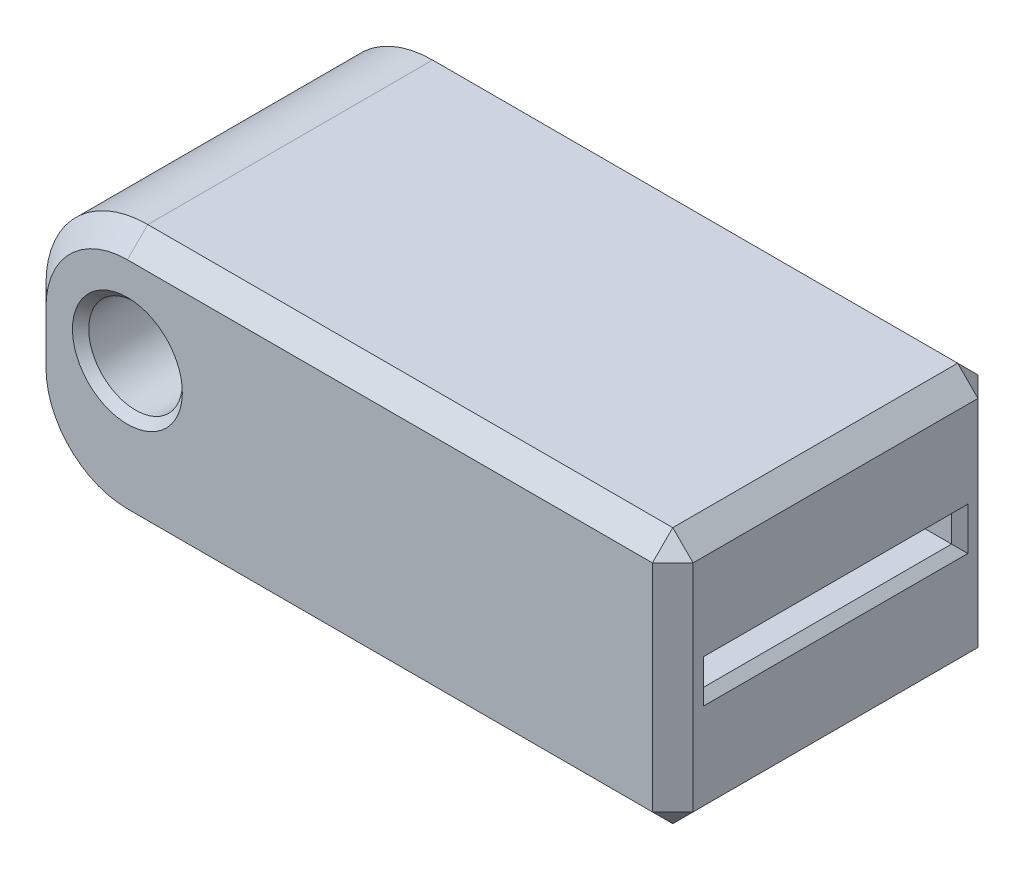
ISO-10303-21;
HEADER;
FILE_DESCRIPTION(('STEP AP214'),'2;1');
FILE_NAME('part.step','',(''),(''),'','','');
FILE_SCHEMA(('AUTOMOTIVE_DESIGN { 1 0 10303 214 1 1 1 1 }'));
ENDSEC;
DATA;
#1=APPLICATION_CONTEXT('core data for automotive mechanical design processes');
#2=APPLICATION_PROTOCOL_DEFINITION('international standard','automotive_design',2000,#1);
#3=PRODUCT_CONTEXT('',#1,'mechanical');
#4=PRODUCT('Part','Part','',(#3));
#5=PRODUCT_RELATED_PRODUCT_CATEGORY('part','',(#4));
#6=PRODUCT_DEFINITION_FORMATION('','',#4);
#7=PRODUCT_DEFINITION_CONTEXT('part definition',#1,'design');
#8=PRODUCT_DEFINITION('design','',#6,#7);
#9=PRODUCT_DEFINITION_SHAPE('','',#8);
#10=(LENGTH_UNIT() NAMED_UNIT(*) SI_UNIT(.MILLI.,.METRE.));
#11=(NAMED_UNIT(*) PLANE_ANGLE_UNIT() SI_UNIT($,.RADIAN.));
#12=(NAMED_UNIT(*) SI_UNIT($,.STERADIAN.) SOLID_ANGLE_UNIT());
#13=UNCERTAINTY_MEASURE_WITH_UNIT(LENGTH_MEASURE(1.E-05),#10,'distance_accuracy_value','');
#14=(GEOMETRIC_REPRESENTATION_CONTEXT(3) GLOBAL_UNCERTAINTY_ASSIGNED_CONTEXT((#13)) GLOBAL_UNIT_ASSIGNED_CONTEXT((#10,
#11,#12)) REPRESENTATION_CONTEXT('',''));
#15=CARTESIAN_POINT('',(0.,0.,0.));
#16=DIRECTION('',(0.,0.,1.));
#17=DIRECTION('',(1.,0.,0.));
#18=AXIS2_PLACEMENT_3D('',#15,#16,#17);
#19=CARTESIAN_POINT('',(51.272609700762,-20.251547834568,7.7312075884992));
#20=DIRECTION('',(0.,0.,-1.));
#21=DIRECTION('',(0.,1.,0.));
#22=AXIS2_PLACEMENT_3D('',#19,#20,#21);
#23=CYLINDRICAL_SURFACE('',#22,1.15);
#24=CARTESIAN_POINT('',(51.272609700762,-20.2515478345679,-10.95));
#25=DIRECTION('',(0.,0.,-1.));
#26=DIRECTION('',(0.,-1.,0.));
#27=AXIS2_PLACEMENT_3D('',#24,#25,#26);
#28=CIRCLE('',#27,1.15);
#29=CARTESIAN_POINT('',(51.272609700762,-21.4015478345679,-10.95));
#30=VERTEX_POINT('',#29);
#31=EDGE_CURVE('E19',#30,#30,#28,.T.);
#32=ORIENTED_EDGE('',*,*,#31,.T.);
#33=EDGE_LOOP('',(#32));
#34=FACE_BOUND('',#33,.T.);
#35=CARTESIAN_POINT('',(51.272609700762,-20.251547834568,-3.35));
#36=DIRECTION('',(0.,0.,1.));
#37=DIRECTION('',(0.,1.,0.));
#38=AXIS2_PLACEMENT_3D('',#35,#36,#37);
#39=CIRCLE('',#38,1.15);
#40=CARTESIAN_POINT('',(51.272609700762,-19.101547834568,-3.35));
#41=VERTEX_POINT('',#40);
#42=EDGE_CURVE('E91',#41,#41,#39,.T.);
#43=ORIENTED_EDGE('',*,*,#42,.T.);
#44=EDGE_LOOP('',(#43));
#45=FACE_BOUND('',#44,.T.);
#46=ADVANCED_FACE('F16',(#34,#45),#23,.F.);
#47=CARTESIAN_POINT('',(53.672609700762,-20.4265478345679,-7.15));
#48=DIRECTION('',(0.,-1.,0.));
#49=DIRECTION('',(0.,0.,-1.));
#50=AXIS2_PLACEMENT_3D('',#47,#48,#49);
#51=CYLINDRICAL_SURFACE('',#50,0.75);
#52=CARTESIAN_POINT('',(53.672609700762,-23.7015478345679,-7.15));
#53=DIRECTION('',(0.,-1.,0.));
#54=DIRECTION('',(0.,0.,1.));
#55=AXIS2_PLACEMENT_3D('',#52,#53,#54);
#56=CIRCLE('',#55,0.75);
#57=CARTESIAN_POINT('',(53.672609700762,-23.7015478345679,-6.4));
#58=VERTEX_POINT('',#57);
#59=EDGE_CURVE('E10',#58,#58,#56,.T.);
#60=ORIENTED_EDGE('',*,*,#59,.T.);
#61=EDGE_LOOP('',(#60));
#62=FACE_BOUND('',#61,.T.);
#63=DIRECTION('',(0.,1.,0.));
#64=VECTOR('',#63,1.);
#65=CARTESIAN_POINT('',(53.672609700762,-20.4265478345679,-7.9));
#66=LINE('',#65,#64);
#67=CARTESIAN_POINT('',(53.672609700762,-21.2765478345679,-7.9));
#68=VERTEX_POINT('',#67);
#69=CARTESIAN_POINT('',(53.672609700762,-20.6265478345679,-7.9));
#70=VERTEX_POINT('',#69);
#71=EDGE_CURVE('E94',#68,#70,#66,.T.);
#72=ORIENTED_EDGE('',*,*,#71,.T.);
#73=CARTESIAN_POINT('',(53.672609700762,-20.6265478345679,-7.15));
#74=DIRECTION('',(0.,1.,0.));
#75=DIRECTION('',(0.,0.,-1.));
#76=AXIS2_PLACEMENT_3D('',#73,#74,#75);
#77=CIRCLE('',#76,0.75);
#78=CARTESIAN_POINT('',(53.672609700762,-20.6265478345679,-6.4));
#79=VERTEX_POINT('',#78);
#80=EDGE_CURVE('E380',#70,#79,#77,.T.);
#81=ORIENTED_EDGE('',*,*,#80,.T.);
#82=DIRECTION('',(0.,-1.,0.));
#83=VECTOR('',#82,1.);
#84=CARTESIAN_POINT('',(53.672609700762,-20.426547834568,-6.4));
#85=LINE('',#84,#83);
#86=CARTESIAN_POINT('',(53.672609700762,-21.2765478345679,-6.4));
#87=VERTEX_POINT('',#86);
#88=EDGE_CURVE('E100',#79,#87,#85,.T.);
#89=ORIENTED_EDGE('',*,*,#88,.T.);
#90=CARTESIAN_POINT('',(53.672609700762,-21.2765478345679,-7.15));
#91=DIRECTION('',(0.,1.,0.));
#92=DIRECTION('',(0.,0.,1.));
#93=AXIS2_PLACEMENT_3D('',#90,#91,#92);
#94=CIRCLE('',#93,0.75);
#95=EDGE_CURVE('E407',#87,#68,#94,.T.);
#96=ORIENTED_EDGE('',*,*,#95,.T.);
#97=EDGE_LOOP('',(#72,#81,#89,#96));
#98=FACE_BOUND('',#97,.T.);
#99=ADVANCED_FACE('F563',(#62,#98),#51,.F.);
#100=CARTESIAN_POINT('',(53.672609700762,-23.9015478345679,-7.15));
#101=DIRECTION('',(0.,-1.,0.));
#102=DIRECTION('',(0.,0.,-1.));
#103=AXIS2_PLACEMENT_3D('',#100,#101,#102);
#104=CONICAL_SURFACE('',#103,0.95,0.785398163397447);
#105=ORIENTED_EDGE('',*,*,#59,.F.);
#106=EDGE_LOOP('',(#105));
#107=FACE_BOUND('',#106,.T.);
#108=CARTESIAN_POINT('',(53.672609700762,-23.9015478345679,-7.15));
#109=DIRECTION('',(0.,1.,0.));
#110=DIRECTION('',(0.,0.,1.));
#111=AXIS2_PLACEMENT_3D('',#108,#109,#110);
#112=CIRCLE('',#111,0.95);
#113=CARTESIAN_POINT('',(53.672609700762,-23.9015478345679,-6.2));
#114=VERTEX_POINT('',#113);
#115=EDGE_CURVE('E106',#114,#114,#112,.T.);
#116=ORIENTED_EDGE('',*,*,#115,.F.);
#117=EDGE_LOOP('',(#116));
#118=FACE_BOUND('',#117,.T.);
#119=ADVANCED_FACE('F553',(#107,#118),#104,.F.);
#120=CARTESIAN_POINT('',(51.272609700762,-20.2515478345679,-11.15));
#121=DIRECTION('',(0.,0.,-1.));
#122=DIRECTION('',(0.,1.,0.));
#123=AXIS2_PLACEMENT_3D('',#120,#121,#122);
#124=CONICAL_SURFACE('',#123,1.35,0.78539816339744);
#125=ORIENTED_EDGE('',*,*,#31,.F.);
#126=EDGE_LOOP('',(#125));
#127=FACE_BOUND('',#126,.T.);
#128=CARTESIAN_POINT('',(51.272609700762,-20.2515478345679,-11.15));
#129=DIRECTION('',(0.,0.,1.));
#130=DIRECTION('',(0.,-1.,0.));
#131=AXIS2_PLACEMENT_3D('',#128,#129,#130);
#132=CIRCLE('',#131,1.35);
#133=CARTESIAN_POINT('',(51.272609700762,-21.6015478345679,-11.15));
#134=VERTEX_POINT('',#133);
#135=EDGE_CURVE('E110',#134,#134,#132,.T.);
#136=ORIENTED_EDGE('',*,*,#135,.F.);
#137=EDGE_LOOP('',(#136));
#138=FACE_BOUND('',#137,.T.);
#139=ADVANCED_FACE('F550',(#127,#138),#124,.F.);
#140=CARTESIAN_POINT('',(51.272609700762,-20.251547834568,-3.35));
#141=DIRECTION('',(0.,0.,1.));
#142=DIRECTION('',(0.,-1.,0.));
#143=AXIS2_PLACEMENT_3D('',#140,#141,#142);
#144=CONICAL_SURFACE('',#143,1.15,0.785398163397448);
#145=ORIENTED_EDGE('',*,*,#42,.F.);
#146=EDGE_LOOP('',(#145));
#147=FACE_BOUND('',#146,.T.);
#148=CARTESIAN_POINT('',(51.272609700762,-20.251547834568,-3.15));
#149=DIRECTION('',(0.,0.,-1.));
#150=DIRECTION('',(0.,1.,0.));
#151=AXIS2_PLACEMENT_3D('',#148,#149,#150);
#152=CIRCLE('',#151,1.35);
#153=CARTESIAN_POINT('',(51.272609700762,-18.901547834568,-3.15));
#154=VERTEX_POINT('',#153);
#155=EDGE_CURVE('E103',#154,#154,#152,.T.);
#156=ORIENTED_EDGE('',*,*,#155,.F.);
#157=EDGE_LOOP('',(#156));
#158=FACE_BOUND('',#157,.T.);
#159=ADVANCED_FACE('F552',(#147,#158),#144,.F.);
#160=CARTESIAN_POINT('',(53.672609700762,-20.751547834568,-7.15));
#161=DIRECTION('',(-1.,0.,0.));
#162=DIRECTION('',(0.,0.,1.));
#163=AXIS2_PLACEMENT_3D('',#160,#161,#162);
#164=PLANE('',#163);
#165=ORIENTED_EDGE('',*,*,#71,.F.);
#166=DIRECTION('',(0.,0.707106781186549,-0.707106781186546));
#167=VECTOR('',#166,1.);
#168=CARTESIAN_POINT('',(53.672609700762,-22.0265478345679,-7.15));
#169=LINE('',#168,#167);
#170=CARTESIAN_POINT('',(53.672609700762,-21.0765478345679,-8.1));
#171=VERTEX_POINT('',#170);
#172=EDGE_CURVE('E416',#68,#171,#169,.T.);
#173=ORIENTED_EDGE('',*,*,#172,.T.);
#174=DIRECTION('',(0.,0.,1.));
#175=VECTOR('',#174,1.);
#176=CARTESIAN_POINT('',(53.672609700762,-21.0765478345679,-10.2));
#177=LINE('',#176,#175);
#178=CARTESIAN_POINT('',(53.672609700762,-21.0765478345679,-10.2));
#179=VERTEX_POINT('',#178);
#180=EDGE_CURVE('E130',#179,#171,#177,.T.);
#181=ORIENTED_EDGE('',*,*,#180,.F.);
#182=DIRECTION('',(0.,-1.,0.));
#183=VECTOR('',#182,1.);
#184=CARTESIAN_POINT('',(53.672609700762,-20.4265478345679,-10.2));
#185=LINE('',#184,#183);
#186=CARTESIAN_POINT('',(53.672609700762,-20.4265478345679,-10.2));
#187=VERTEX_POINT('',#186);
#188=EDGE_CURVE('E124',#187,#179,#185,.T.);
#189=ORIENTED_EDGE('',*,*,#188,.F.);
#190=DIRECTION('',(0.,0.,-1.));
#191=VECTOR('',#190,1.);
#192=CARTESIAN_POINT('',(53.672609700762,-20.426547834568,-4.1));
#193=LINE('',#192,#191);
#194=CARTESIAN_POINT('',(53.672609700762,-20.4265478345679,-7.7));
#195=VERTEX_POINT('',#194);
#196=EDGE_CURVE('E119',#195,#187,#193,.T.);
#197=ORIENTED_EDGE('',*,*,#196,.F.);
#198=DIRECTION('',(0.,-0.707106781186548,-0.707106781186547));
#199=VECTOR('',#198,1.);
#200=CARTESIAN_POINT('',(53.672609700762,-19.8765478345679,-7.15));
#201=LINE('',#200,#199);
#202=EDGE_CURVE('E389',#195,#70,#201,.T.);
#203=ORIENTED_EDGE('',*,*,#202,.T.);
#204=EDGE_LOOP('',(#165,#173,#181,#189,#197,#203));
#205=FACE_BOUND('',#204,.T.);
#206=ADVANCED_FACE('F561',(#205),#164,.F.);
#207=CARTESIAN_POINT('',(53.672609700762,-20.751547834568,-7.15));
#208=DIRECTION('',(-1.,0.,0.));
#209=DIRECTION('',(0.,0.,1.));
#210=AXIS2_PLACEMENT_3D('',#207,#208,#209);
#211=PLANE('',#210);
#212=ORIENTED_EDGE('',*,*,#88,.F.);
#213=DIRECTION('',(0.,0.707106781186548,-0.707106781186547));
#214=VECTOR('',#213,1.);
#215=CARTESIAN_POINT('',(53.672609700762,-19.8765478345679,-7.15));
#216=LINE('',#215,#214);
#217=CARTESIAN_POINT('',(53.672609700762,-20.426547834568,-6.6));
#218=VERTEX_POINT('',#217);
#219=EDGE_CURVE('E384',#79,#218,#216,.T.);
#220=ORIENTED_EDGE('',*,*,#219,.T.);
#221=DIRECTION('',(0.,0.,-1.));
#222=VECTOR('',#221,1.);
#223=CARTESIAN_POINT('',(53.672609700762,-20.426547834568,-4.1));
#224=LINE('',#223,#222);
#225=CARTESIAN_POINT('',(53.672609700762,-20.426547834568,-4.1));
#226=VERTEX_POINT('',#225);
#227=EDGE_CURVE('E120',#226,#218,#224,.T.);
#228=ORIENTED_EDGE('',*,*,#227,.F.);
#229=DIRECTION('',(0.,1.,0.));
#230=VECTOR('',#229,1.);
#231=CARTESIAN_POINT('',(53.672609700762,-21.0765478345679,-4.1));
#232=LINE('',#231,#230);
#233=CARTESIAN_POINT('',(53.672609700762,-21.0765478345679,-4.1));
#234=VERTEX_POINT('',#233);
#235=EDGE_CURVE('E114',#234,#226,#232,.T.);
#236=ORIENTED_EDGE('',*,*,#235,.F.);
#237=DIRECTION('',(0.,0.,1.));
#238=VECTOR('',#237,1.);
#239=CARTESIAN_POINT('',(53.672609700762,-21.0765478345679,-10.2));
#240=LINE('',#239,#238);
#241=CARTESIAN_POINT('',(53.672609700762,-21.0765478345679,-6.2));
#242=VERTEX_POINT('',#241);
#243=EDGE_CURVE('E134',#242,#234,#240,.T.);
#244=ORIENTED_EDGE('',*,*,#243,.F.);
#245=DIRECTION('',(0.,-0.707106781186549,-0.707106781186546));
#246=VECTOR('',#245,1.);
#247=CARTESIAN_POINT('',(53.672609700762,-22.0265478345679,-7.15));
#248=LINE('',#247,#246);
#249=EDGE_CURVE('E403',#242,#87,#248,.T.);
#250=ORIENTED_EDGE('',*,*,#249,.T.);
#251=EDGE_LOOP('',(#212,#220,#228,#236,#244,#250));
#252=FACE_BOUND('',#251,.T.);
#253=ADVANCED_FACE('F873',(#252),#211,.F.);
#254=CARTESIAN_POINT('',(64.672609700762,-20.751547834568,-7.15));
#255=DIRECTION('',(1.,0.,0.));
#256=DIRECTION('',(0.,-1.,0.));
#257=AXIS2_PLACEMENT_3D('',#254,#255,#256);
#258=PLANE('',#257);
#259=DIRECTION('',(0.,0.,1.));
#260=VECTOR('',#259,1.);
#261=CARTESIAN_POINT('',(64.672609700762,-21.2765478345679,-7.15));
#262=LINE('',#261,#260);
#263=CARTESIAN_POINT('',(64.672609700762,-21.2765478345679,-10.4));
#264=VERTEX_POINT('',#263);
#265=CARTESIAN_POINT('',(64.672609700762,-21.2765478345679,-3.9));
#266=VERTEX_POINT('',#265);
#267=EDGE_CURVE('E346',#264,#266,#262,.T.);
#268=ORIENTED_EDGE('',*,*,#267,.T.);
#269=DIRECTION('',(0.,1.,0.));
#270=VECTOR('',#269,1.);
#271=CARTESIAN_POINT('',(64.672609700762,-20.751547834568,-3.9));
#272=LINE('',#271,#270);
#273=CARTESIAN_POINT('',(64.672609700762,-20.2265478345679,-3.9));
#274=VERTEX_POINT('',#273);
#275=EDGE_CURVE('E364',#266,#274,#272,.T.);
#276=ORIENTED_EDGE('',*,*,#275,.T.);
#277=DIRECTION('',(0.,0.,-1.));
#278=VECTOR('',#277,1.);
#279=CARTESIAN_POINT('',(64.672609700762,-20.2265478345679,-7.15));
#280=LINE('',#279,#278);
#281=CARTESIAN_POINT('',(64.672609700762,-20.2265478345679,-10.4));
#282=VERTEX_POINT('',#281);
#283=EDGE_CURVE('E359',#274,#282,#280,.T.);
#284=ORIENTED_EDGE('',*,*,#283,.T.);
#285=DIRECTION('',(0.,-1.,0.));
#286=VECTOR('',#285,1.);
#287=CARTESIAN_POINT('',(64.672609700762,-20.751547834568,-10.4));
#288=LINE('',#287,#286);
#289=EDGE_CURVE('E335',#282,#264,#288,.T.);
#290=ORIENTED_EDGE('',*,*,#289,.T.);
#291=EDGE_LOOP('',(#268,#276,#284,#290));
#292=FACE_BOUND('',#291,.T.);
#293=DIRECTION('',(0.,-1.,0.));
#294=VECTOR('',#293,1.);
#295=CARTESIAN_POINT('',(64.672609700762,-23.901547834568,-3.65));
#296=LINE('',#295,#294);
#297=CARTESIAN_POINT('',(64.672609700762,-18.1015478345679,-3.65));
#298=VERTEX_POINT('',#297);
#299=CARTESIAN_POINT('',(64.672609700762,-23.4015478345679,-3.65));
#300=VERTEX_POINT('',#299);
#301=EDGE_CURVE('E189',#298,#300,#296,.T.);
#302=ORIENTED_EDGE('',*,*,#301,.T.);
#303=DIRECTION('',(0.,0.,-1.));
#304=VECTOR('',#303,1.);
#305=CARTESIAN_POINT('',(64.672609700762,-23.4015478345679,-11.15));
#306=LINE('',#305,#304);
#307=CARTESIAN_POINT('',(64.672609700762,-23.4015478345679,-10.65));
#308=VERTEX_POINT('',#307);
#309=EDGE_CURVE('E172',#300,#308,#306,.T.);
#310=ORIENTED_EDGE('',*,*,#309,.T.);
#311=DIRECTION('',(0.,1.,0.));
#312=VECTOR('',#311,1.);
#313=CARTESIAN_POINT('',(64.672609700762,-17.6015478345679,-10.65));
#314=LINE('',#313,#312);
#315=CARTESIAN_POINT('',(64.672609700762,-18.1015478345679,-10.65));
#316=VERTEX_POINT('',#315);
#317=EDGE_CURVE('E249',#308,#316,#314,.T.);
#318=ORIENTED_EDGE('',*,*,#317,.T.);
#319=DIRECTION('',(0.,0.,1.));
#320=VECTOR('',#319,1.);
#321=CARTESIAN_POINT('',(64.672609700762,-18.1015478345679,-3.15));
#322=LINE('',#321,#320);
#323=EDGE_CURVE('E262',#316,#298,#322,.T.);
#324=ORIENTED_EDGE('',*,*,#323,.T.);
#325=EDGE_LOOP('',(#302,#310,#318,#324));
#326=FACE_BOUND('',#325,.T.);
#327=ADVANCED_FACE('F788',(#292,#326),#258,.T.);
#328=CARTESIAN_POINT('',(64.672609700762,-17.6015478345679,-3.15));
#329=DIRECTION('',(0.,0.,-1.));
#330=DIRECTION('',(-1.,0.,0.));
#331=AXIS2_PLACEMENT_3D('',#328,#329,#330);
#332=PLANE('',#331);
#333=ORIENTED_EDGE('',*,*,#155,.T.);
#334=EDGE_LOOP('',(#333));
#335=FACE_BOUND('',#334,.T.);
#336=DIRECTION('',(1.,0.,0.));
#337=VECTOR('',#336,1.);
#338=CARTESIAN_POINT('',(64.672609700762,-23.4015478345679,-3.15));
#339=LINE('',#338,#337);
#340=CARTESIAN_POINT('',(51.272609700762,-23.4015478345679,-3.15));
#341=VERTEX_POINT('',#340);
#342=CARTESIAN_POINT('',(64.172609700762,-23.4015478345679,-3.15));
#343=VERTEX_POINT('',#342);
#344=EDGE_CURVE('E153',#341,#343,#339,.T.);
#345=ORIENTED_EDGE('',*,*,#344,.T.);
#346=DIRECTION('',(0.,1.,0.));
#347=VECTOR('',#346,1.);
#348=CARTESIAN_POINT('',(64.172609700762,-17.6015478345679,-3.15));
#349=LINE('',#348,#347);
#350=CARTESIAN_POINT('',(64.172609700762,-18.1015478345679,-3.15));
#351=VERTEX_POINT('',#350);
#352=EDGE_CURVE('E184',#343,#351,#349,.T.);
#353=ORIENTED_EDGE('',*,*,#352,.T.);
#354=DIRECTION('',(-1.,0.,0.));
#355=VECTOR('',#354,1.);
#356=CARTESIAN_POINT('',(64.672609700762,-18.1015478345679,-3.15));
#357=LINE('',#356,#355);
#358=CARTESIAN_POINT('',(51.272609700762,-18.1015478345679,-3.15));
#359=VERTEX_POINT('',#358);
#360=EDGE_CURVE('E199',#351,#359,#357,.T.);
#361=ORIENTED_EDGE('',*,*,#360,.T.);
#362=CARTESIAN_POINT('',(51.272609700762,-20.1015478345679,-3.15));
#363=DIRECTION('',(0.,0.,1.));
#364=DIRECTION('',(0.,1.,0.));
#365=AXIS2_PLACEMENT_3D('',#362,#363,#364);
#366=CIRCLE('',#365,2.);
#367=CARTESIAN_POINT('',(49.272609700762,-20.1015478345679,-3.15));
#368=VERTEX_POINT('',#367);
#369=EDGE_CURVE('E171',#359,#368,#366,.T.);
#370=ORIENTED_EDGE('',*,*,#369,.T.);
#371=DIRECTION('',(0.,-1.,0.));
#372=VECTOR('',#371,1.);
#373=CARTESIAN_POINT('',(49.272609700762,-17.6015478345679,-3.15));
#374=LINE('',#373,#372);
#375=CARTESIAN_POINT('',(49.272609700762,-21.4015478345679,-3.15));
#376=VERTEX_POINT('',#375);
#377=EDGE_CURVE('E327',#368,#376,#374,.T.);
#378=ORIENTED_EDGE('',*,*,#377,.T.);
#379=CARTESIAN_POINT('',(51.272609700762,-21.4015478345679,-3.15));
#380=DIRECTION('',(0.,0.,1.));
#381=DIRECTION('',(0.,1.,0.));
#382=AXIS2_PLACEMENT_3D('',#379,#380,#381);
#383=CIRCLE('',#382,2.);
#384=EDGE_CURVE('E142',#376,#341,#383,.T.);
#385=ORIENTED_EDGE('',*,*,#384,.T.);
#386=EDGE_LOOP('',(#345,#353,#361,#370,#378,#385));
#387=FACE_BOUND('',#386,.T.);
#388=ADVANCED_FACE('F464',(#335,#387),#332,.F.);
#389=CARTESIAN_POINT('',(64.672609700762,-23.901547834568,-3.15));
#390=DIRECTION('',(0.,1.,0.));
#391=DIRECTION('',(1.,0.,0.));
#392=AXIS2_PLACEMENT_3D('',#389,#390,#391);
#393=PLANE('',#392);
#394=ORIENTED_EDGE('',*,*,#115,.T.);
#395=EDGE_LOOP('',(#394));
#396=FACE_BOUND('',#395,.T.);
#397=DIRECTION('',(0.,0.,-1.));
#398=VECTOR('',#397,1.);
#399=CARTESIAN_POINT('',(51.272609700762,-23.9015478345679,-3.15));
#400=LINE('',#399,#398);
#401=CARTESIAN_POINT('',(51.272609700762,-23.9015478345679,-3.65));
#402=VERTEX_POINT('',#401);
#403=CARTESIAN_POINT('',(51.272609700762,-23.9015478345679,-10.65));
#404=VERTEX_POINT('',#403);
#405=EDGE_CURVE('E140',#402,#404,#400,.T.);
#406=ORIENTED_EDGE('',*,*,#405,.T.);
#407=DIRECTION('',(1.,0.,0.));
#408=VECTOR('',#407,1.);
#409=CARTESIAN_POINT('',(64.672609700762,-23.9015478345679,-10.65));
#410=LINE('',#409,#408);
#411=CARTESIAN_POINT('',(64.172609700762,-23.9015478345679,-10.65));
#412=VERTEX_POINT('',#411);
#413=EDGE_CURVE('E208',#404,#412,#410,.T.);
#414=ORIENTED_EDGE('',*,*,#413,.T.);
#415=DIRECTION('',(0.,0.,1.));
#416=VECTOR('',#415,1.);
#417=CARTESIAN_POINT('',(64.172609700762,-23.901547834568,-3.15));
#418=LINE('',#417,#416);
#419=CARTESIAN_POINT('',(64.172609700762,-23.901547834568,-3.65));
#420=VERTEX_POINT('',#419);
#421=EDGE_CURVE('E177',#412,#420,#418,.T.);
#422=ORIENTED_EDGE('',*,*,#421,.T.);
#423=DIRECTION('',(-1.,0.,0.));
#424=VECTOR('',#423,1.);
#425=CARTESIAN_POINT('',(64.672609700762,-23.901547834568,-3.65));
#426=LINE('',#425,#424);
#427=EDGE_CURVE('E157',#420,#402,#426,.T.);
#428=ORIENTED_EDGE('',*,*,#427,.T.);
#429=EDGE_LOOP('',(#406,#414,#422,#428));
#430=FACE_BOUND('',#429,.T.);
#431=ADVANCED_FACE('F797',(#396,#430),#393,.F.);
#432=CARTESIAN_POINT('',(64.672609700762,-23.9015478345679,-11.15));
#433=DIRECTION('',(0.,0.,1.));
#434=DIRECTION('',(0.,-1.,0.));
#435=AXIS2_PLACEMENT_3D('',#432,#433,#434);
#436=PLANE('',#435);
#437=ORIENTED_EDGE('',*,*,#135,.T.);
#438=EDGE_LOOP('',(#437));
#439=FACE_BOUND('',#438,.T.);
#440=DIRECTION('',(1.,0.,0.));
#441=VECTOR('',#440,1.);
#442=CARTESIAN_POINT('',(64.672609700762,-18.1015478345679,-11.15));
#443=LINE('',#442,#441);
#444=CARTESIAN_POINT('',(51.272609700762,-18.1015478345679,-11.15));
#445=VERTEX_POINT('',#444);
#446=CARTESIAN_POINT('',(64.172609700762,-18.1015478345679,-11.15));
#447=VERTEX_POINT('',#446);
#448=EDGE_CURVE('E316',#445,#447,#443,.T.);
#449=ORIENTED_EDGE('',*,*,#448,.T.);
#450=DIRECTION('',(0.,-1.,0.));
#451=VECTOR('',#450,1.);
#452=CARTESIAN_POINT('',(64.172609700762,-23.9015478345679,-11.15));
#453=LINE('',#452,#451);
#454=CARTESIAN_POINT('',(64.172609700762,-23.4015478345679,-11.15));
#455=VERTEX_POINT('',#454);
#456=EDGE_CURVE('E250',#447,#455,#453,.T.);
#457=ORIENTED_EDGE('',*,*,#456,.T.);
#458=DIRECTION('',(-1.,0.,0.));
#459=VECTOR('',#458,1.);
#460=CARTESIAN_POINT('',(64.672609700762,-23.4015478345679,-11.15));
#461=LINE('',#460,#459);
#462=CARTESIAN_POINT('',(51.272609700762,-23.4015478345679,-11.15));
#463=VERTEX_POINT('',#462);
#464=EDGE_CURVE('E204',#455,#463,#461,.T.);
#465=ORIENTED_EDGE('',*,*,#464,.T.);
#466=CARTESIAN_POINT('',(51.272609700762,-21.4015478345679,-11.15));
#467=DIRECTION('',(0.,0.,-1.));
#468=DIRECTION('',(0.,-1.,0.));
#469=AXIS2_PLACEMENT_3D('',#466,#467,#468);
#470=CIRCLE('',#469,2.);
#471=CARTESIAN_POINT('',(49.272609700762,-21.4015478345679,-11.15));
#472=VERTEX_POINT('',#471);
#473=EDGE_CURVE('E225',#463,#472,#470,.T.);
#474=ORIENTED_EDGE('',*,*,#473,.T.);
#475=DIRECTION('',(0.,1.,0.));
#476=VECTOR('',#475,1.);
#477=CARTESIAN_POINT('',(49.272609700762,-23.9015478345679,-11.15));
#478=LINE('',#477,#476);
#479=CARTESIAN_POINT('',(49.272609700762,-20.1015478345679,-11.15));
#480=VERTEX_POINT('',#479);
#481=EDGE_CURVE('E274',#472,#480,#478,.T.);
#482=ORIENTED_EDGE('',*,*,#481,.T.);
#483=CARTESIAN_POINT('',(51.272609700762,-20.1015478345679,-11.15));
#484=DIRECTION('',(0.,0.,-1.));
#485=DIRECTION('',(0.,-1.,0.));
#486=AXIS2_PLACEMENT_3D('',#483,#484,#485);
#487=CIRCLE('',#486,2.);
#488=EDGE_CURVE('E290',#480,#445,#487,.T.);
#489=ORIENTED_EDGE('',*,*,#488,.T.);
#490=EDGE_LOOP('',(#449,#457,#465,#474,#482,#489));
#491=FACE_BOUND('',#490,.T.);
#492=ADVANCED_FACE('F547',(#439,#491),#436,.F.);
#493=CARTESIAN_POINT('',(64.672609700762,-17.6015478345679,-11.15));
#494=DIRECTION('',(0.,-1.,0.));
#495=DIRECTION('',(0.,0.,-1.));
#496=AXIS2_PLACEMENT_3D('',#493,#494,#495);
#497=PLANE('',#496);
#498=DIRECTION('',(0.,0.,-1.));
#499=VECTOR('',#498,1.);
#500=CARTESIAN_POINT('',(64.172609700762,-17.6015478345679,-11.15));
#501=LINE('',#500,#499);
#502=CARTESIAN_POINT('',(64.172609700762,-17.6015478345679,-3.65));
#503=VERTEX_POINT('',#502);
#504=CARTESIAN_POINT('',(64.172609700762,-17.6015478345679,-10.65));
#505=VERTEX_POINT('',#504);
#506=EDGE_CURVE('E258',#503,#505,#501,.T.);
#507=ORIENTED_EDGE('',*,*,#506,.T.);
#508=DIRECTION('',(-1.,0.,0.));
#509=VECTOR('',#508,1.);
#510=CARTESIAN_POINT('',(64.672609700762,-17.6015478345679,-10.65));
#511=LINE('',#510,#509);
#512=CARTESIAN_POINT('',(51.272609700762,-17.6015478345679,-10.65));
#513=VERTEX_POINT('',#512);
#514=EDGE_CURVE('E308',#505,#513,#511,.T.);
#515=ORIENTED_EDGE('',*,*,#514,.T.);
#516=DIRECTION('',(0.,0.,1.));
#517=VECTOR('',#516,1.);
#518=CARTESIAN_POINT('',(51.272609700762,-17.6015478345679,-11.15));
#519=LINE('',#518,#517);
#520=CARTESIAN_POINT('',(51.272609700762,-17.6015478345679,-3.65));
#521=VERTEX_POINT('',#520);
#522=EDGE_CURVE('E136',#513,#521,#519,.T.);
#523=ORIENTED_EDGE('',*,*,#522,.T.);
#524=DIRECTION('',(1.,0.,0.));
#525=VECTOR('',#524,1.);
#526=CARTESIAN_POINT('',(64.672609700762,-17.6015478345679,-3.65));
#527=LINE('',#526,#525);
#528=EDGE_CURVE('E190',#521,#503,#527,.T.);
#529=ORIENTED_EDGE('',*,*,#528,.T.);
#530=EDGE_LOOP('',(#507,#515,#523,#529));
#531=FACE_BOUND('',#530,.T.);
#532=ADVANCED_FACE('F486',(#531),#497,.F.);
#533=CARTESIAN_POINT('',(48.772609700762,-20.751547834568,-7.15));
#534=DIRECTION('',(1.,0.,0.));
#535=DIRECTION('',(0.,-1.,0.));
#536=AXIS2_PLACEMENT_3D('',#533,#534,#535);
#537=PLANE('',#536);
#538=DIRECTION('',(0.,0.,1.));
#539=VECTOR('',#538,1.);
#540=CARTESIAN_POINT('',(48.772609700762,-21.4015478345679,-7.15));
#541=LINE('',#540,#539);
#542=CARTESIAN_POINT('',(48.772609700762,-21.4015478345679,-10.65));
#543=VERTEX_POINT('',#542);
#544=CARTESIAN_POINT('',(48.772609700762,-21.4015478345679,-3.65));
#545=VERTEX_POINT('',#544);
#546=EDGE_CURVE('E135',#543,#545,#541,.T.);
#547=ORIENTED_EDGE('',*,*,#546,.T.);
#548=DIRECTION('',(0.,1.,0.));
#549=VECTOR('',#548,1.);
#550=CARTESIAN_POINT('',(48.772609700762,-20.751547834568,-3.65));
#551=LINE('',#550,#549);
#552=CARTESIAN_POINT('',(48.772609700762,-20.1015478345679,-3.65));
#553=VERTEX_POINT('',#552);
#554=EDGE_CURVE('E331',#545,#553,#551,.T.);
#555=ORIENTED_EDGE('',*,*,#554,.T.);
#556=DIRECTION('',(0.,0.,-1.));
#557=VECTOR('',#556,1.);
#558=CARTESIAN_POINT('',(48.772609700762,-20.1015478345679,-7.15));
#559=LINE('',#558,#557);
#560=CARTESIAN_POINT('',(48.772609700762,-20.1015478345679,-10.65));
#561=VERTEX_POINT('',#560);
#562=EDGE_CURVE('E141',#553,#561,#559,.T.);
#563=ORIENTED_EDGE('',*,*,#562,.T.);
#564=DIRECTION('',(0.,-1.,0.));
#565=VECTOR('',#564,1.);
#566=CARTESIAN_POINT('',(48.772609700762,-20.751547834568,-10.65));
#567=LINE('',#566,#565);
#568=EDGE_CURVE('E270',#561,#543,#567,.T.);
#569=ORIENTED_EDGE('',*,*,#568,.T.);
#570=EDGE_LOOP('',(#547,#555,#563,#569));
#571=FACE_BOUND('',#570,.T.);
#572=ADVANCED_FACE('F444',(#571),#537,.F.);
#573=CARTESIAN_POINT('',(53.672609700762,-21.0765478345679,-4.1));
#574=DIRECTION('',(0.,0.,-1.));
#575=DIRECTION('',(-1.,0.,0.));
#576=AXIS2_PLACEMENT_3D('',#573,#574,#575);
#577=PLANE('',#576);
#578=DIRECTION('',(1.,0.,0.));
#579=VECTOR('',#578,1.);
#580=CARTESIAN_POINT('',(53.672609700762,-20.426547834568,-4.1));
#581=LINE('',#580,#579);
#582=CARTESIAN_POINT('',(64.472609700762,-20.426547834568,-4.1));
#583=VERTEX_POINT('',#582);
#584=EDGE_CURVE('E115',#226,#583,#581,.T.);
#585=ORIENTED_EDGE('',*,*,#584,.T.);
#586=DIRECTION('',(0.,-1.,0.));
#587=VECTOR('',#586,1.);
#588=CARTESIAN_POINT('',(64.472609700762,-21.0765478345679,-4.1));
#589=LINE('',#588,#587);
#590=CARTESIAN_POINT('',(64.472609700762,-21.0765478345679,-4.1));
#591=VERTEX_POINT('',#590);
#592=EDGE_CURVE('E372',#583,#591,#589,.T.);
#593=ORIENTED_EDGE('',*,*,#592,.T.);
#594=DIRECTION('',(1.,0.,0.));
#595=VECTOR('',#594,1.);
#596=CARTESIAN_POINT('',(53.672609700762,-21.0765478345679,-4.1));
#597=LINE('',#596,#595);
#598=EDGE_CURVE('E149',#234,#591,#597,.T.);
#599=ORIENTED_EDGE('',*,*,#598,.F.);
#600=ORIENTED_EDGE('',*,*,#235,.T.);
#601=EDGE_LOOP('',(#585,#593,#599,#600));
#602=FACE_BOUND('',#601,.T.);
#603=ADVANCED_FACE('F855',(#602),#577,.T.);
#604=CARTESIAN_POINT('',(53.672609700762,-20.426547834568,-4.1));
#605=DIRECTION('',(0.,-1.,0.));
#606=DIRECTION('',(0.,0.,-1.));
#607=AXIS2_PLACEMENT_3D('',#604,#605,#606);
#608=PLANE('',#607);
#609=ORIENTED_EDGE('',*,*,#227,.T.);
#610=CARTESIAN_POINT('',(53.672609700762,-20.4265478345679,-7.15));
#611=DIRECTION('',(0.,-1.,0.));
#612=DIRECTION('',(0.,0.,-1.));
#613=AXIS2_PLACEMENT_3D('',#610,#611,#612);
#614=CIRCLE('',#613,0.55);
#615=EDGE_CURVE('E385',#218,#195,#614,.T.);
#616=ORIENTED_EDGE('',*,*,#615,.T.);
#617=ORIENTED_EDGE('',*,*,#196,.T.);
#618=DIRECTION('',(1.,0.,0.));
#619=VECTOR('',#618,1.);
#620=CARTESIAN_POINT('',(53.672609700762,-20.4265478345679,-10.2));
#621=LINE('',#620,#619);
#622=CARTESIAN_POINT('',(64.472609700762,-20.426547834568,-10.2));
#623=VERTEX_POINT('',#622);
#624=EDGE_CURVE('E125',#187,#623,#621,.T.);
#625=ORIENTED_EDGE('',*,*,#624,.T.);
#626=DIRECTION('',(0.,0.,1.));
#627=VECTOR('',#626,1.);
#628=CARTESIAN_POINT('',(64.472609700762,-20.426547834568,-4.1));
#629=LINE('',#628,#627);
#630=EDGE_CURVE('E355',#623,#583,#629,.T.);
#631=ORIENTED_EDGE('',*,*,#630,.T.);
#632=ORIENTED_EDGE('',*,*,#584,.F.);
#633=EDGE_LOOP('',(#609,#616,#617,#625,#631,#632));
#634=FACE_BOUND('',#633,.T.);
#635=ADVANCED_FACE('F600',(#634),#608,.T.);
#636=CARTESIAN_POINT('',(53.672609700762,-20.4265478345679,-10.2));
#637=DIRECTION('',(0.,0.,1.));
#638=DIRECTION('',(0.,-1.,0.));
#639=AXIS2_PLACEMENT_3D('',#636,#637,#638);
#640=PLANE('',#639);
#641=DIRECTION('',(1.,0.,0.));
#642=VECTOR('',#641,1.);
#643=CARTESIAN_POINT('',(53.672609700762,-21.0765478345679,-10.2));
#644=LINE('',#643,#642);
#645=CARTESIAN_POINT('',(64.472609700762,-21.0765478345679,-10.2));
#646=VERTEX_POINT('',#645);
#647=EDGE_CURVE('E129',#179,#646,#644,.T.);
#648=ORIENTED_EDGE('',*,*,#647,.T.);
#649=DIRECTION('',(0.,1.,0.));
#650=VECTOR('',#649,1.);
#651=CARTESIAN_POINT('',(64.472609700762,-20.426547834568,-10.2));
#652=LINE('',#651,#650);
#653=EDGE_CURVE('E342',#646,#623,#652,.T.);
#654=ORIENTED_EDGE('',*,*,#653,.T.);
#655=ORIENTED_EDGE('',*,*,#624,.F.);
#656=ORIENTED_EDGE('',*,*,#188,.T.);
#657=EDGE_LOOP('',(#648,#654,#655,#656));
#658=FACE_BOUND('',#657,.T.);
#659=ADVANCED_FACE('F848',(#658),#640,.T.);
#660=CARTESIAN_POINT('',(53.672609700762,-21.0765478345679,-10.2));
#661=DIRECTION('',(0.,1.,0.));
#662=DIRECTION('',(1.,0.,0.));
#663=AXIS2_PLACEMENT_3D('',#660,#661,#662);
#664=PLANE('',#663);
#665=ORIENTED_EDGE('',*,*,#180,.T.);
#666=CARTESIAN_POINT('',(53.672609700762,-21.0765478345679,-7.15));
#667=DIRECTION('',(0.,-1.,0.));
#668=DIRECTION('',(0.,0.,1.));
#669=AXIS2_PLACEMENT_3D('',#666,#667,#668);
#670=CIRCLE('',#669,0.95);
#671=EDGE_CURVE('E399',#171,#242,#670,.T.);
#672=ORIENTED_EDGE('',*,*,#671,.T.);
#673=ORIENTED_EDGE('',*,*,#243,.T.);
#674=ORIENTED_EDGE('',*,*,#598,.T.);
#675=DIRECTION('',(0.,0.,-1.));
#676=VECTOR('',#675,1.);
#677=CARTESIAN_POINT('',(64.472609700762,-21.0765478345679,-10.2));
#678=LINE('',#677,#676);
#679=EDGE_CURVE('E350',#591,#646,#678,.T.);
#680=ORIENTED_EDGE('',*,*,#679,.T.);
#681=ORIENTED_EDGE('',*,*,#647,.F.);
#682=EDGE_LOOP('',(#665,#672,#673,#674,#680,#681));
#683=FACE_BOUND('',#682,.T.);
#684=ADVANCED_FACE('F845',(#683),#664,.T.);
#685=CARTESIAN_POINT('',(51.272609700762,-21.4015478345679,-3.15));
#686=DIRECTION('',(0.,0.,-1.));
#687=DIRECTION('',(0.,1.,0.));
#688=AXIS2_PLACEMENT_3D('',#685,#686,#687);
#689=CYLINDRICAL_SURFACE('',#688,2.5);
#690=ORIENTED_EDGE('',*,*,#405,.F.);
#691=CARTESIAN_POINT('',(51.272609700762,-21.4015478345679,-3.65));
#692=DIRECTION('',(0.,0.,-1.));
#693=DIRECTION('',(0.,1.,0.));
#694=AXIS2_PLACEMENT_3D('',#691,#692,#693);
#695=CIRCLE('',#694,2.5);
#696=EDGE_CURVE('E145',#402,#545,#695,.T.);
#697=ORIENTED_EDGE('',*,*,#696,.T.);
#698=ORIENTED_EDGE('',*,*,#546,.F.);
#699=CARTESIAN_POINT('',(51.272609700762,-21.4015478345679,-10.65));
#700=DIRECTION('',(0.,0.,1.));
#701=DIRECTION('',(0.,-1.,0.));
#702=AXIS2_PLACEMENT_3D('',#699,#700,#701);
#703=CIRCLE('',#702,2.5);
#704=EDGE_CURVE('E238',#543,#404,#703,.T.);
#705=ORIENTED_EDGE('',*,*,#704,.T.);
#706=EDGE_LOOP('',(#690,#697,#698,#705));
#707=FACE_BOUND('',#706,.T.);
#708=ADVANCED_FACE('F454',(#707),#689,.T.);
#709=CARTESIAN_POINT('',(51.272609700762,-20.1015478345679,-11.15));
#710=DIRECTION('',(0.,0.,1.));
#711=DIRECTION('',(0.,-1.,0.));
#712=AXIS2_PLACEMENT_3D('',#709,#710,#711);
#713=CYLINDRICAL_SURFACE('',#712,2.5);
#714=ORIENTED_EDGE('',*,*,#562,.F.);
#715=CARTESIAN_POINT('',(51.272609700762,-20.1015478345679,-3.65));
#716=DIRECTION('',(0.,0.,-1.));
#717=DIRECTION('',(0.,1.,0.));
#718=AXIS2_PLACEMENT_3D('',#715,#716,#717);
#719=CIRCLE('',#718,2.5);
#720=EDGE_CURVE('E167',#553,#521,#719,.T.);
#721=ORIENTED_EDGE('',*,*,#720,.T.);
#722=ORIENTED_EDGE('',*,*,#522,.F.);
#723=CARTESIAN_POINT('',(51.272609700762,-20.1015478345679,-10.65));
#724=DIRECTION('',(0.,0.,1.));
#725=DIRECTION('',(0.,-1.,0.));
#726=AXIS2_PLACEMENT_3D('',#723,#724,#725);
#727=CIRCLE('',#726,2.5);
#728=EDGE_CURVE('E297',#513,#561,#727,.T.);
#729=ORIENTED_EDGE('',*,*,#728,.T.);
#730=EDGE_LOOP('',(#714,#721,#722,#729));
#731=FACE_BOUND('',#730,.T.);
#732=ADVANCED_FACE('F475',(#731),#713,.T.);
#733=CARTESIAN_POINT('',(51.272609700762,-21.4015478345679,-3.15));
#734=DIRECTION('',(0.,0.,-1.));
#735=DIRECTION('',(0.,1.,0.));
#736=AXIS2_PLACEMENT_3D('',#733,#734,#735);
#737=CONICAL_SURFACE('',#736,2.,0.785398163397448);
#738=DIRECTION('',(0.707106781186548,0.,0.707106781186548));
#739=VECTOR('',#738,1.);
#740=CARTESIAN_POINT('',(48.772609700762,-21.4015478345679,-3.65));
#741=LINE('',#740,#739);
#742=EDGE_CURVE('E166',#545,#376,#741,.T.);
#743=ORIENTED_EDGE('',*,*,#742,.F.);
#744=ORIENTED_EDGE('',*,*,#696,.F.);
#745=DIRECTION('',(0.,-0.707106781186547,-0.707106781186548));
#746=VECTOR('',#745,1.);
#747=CARTESIAN_POINT('',(51.272609700762,-23.4015478345679,-3.15));
#748=LINE('',#747,#746);
#749=EDGE_CURVE('E161',#341,#402,#748,.T.);
#750=ORIENTED_EDGE('',*,*,#749,.F.);
#751=ORIENTED_EDGE('',*,*,#384,.F.);
#752=EDGE_LOOP('',(#743,#744,#750,#751));
#753=FACE_BOUND('',#752,.T.);
#754=ADVANCED_FACE('F461',(#753),#737,.T.);
#755=CARTESIAN_POINT('',(64.672609700762,-23.901547834568,-3.65));
#756=DIRECTION('',(0.,0.707106781186547,-0.707106781186548));
#757=DIRECTION('',(-1.,0.,0.));
#758=AXIS2_PLACEMENT_3D('',#755,#756,#757);
#759=PLANE('',#758);
#760=ORIENTED_EDGE('',*,*,#749,.T.);
#761=ORIENTED_EDGE('',*,*,#427,.F.);
#762=DIRECTION('',(0.,-0.707106781186548,-0.707106781186547));
#763=VECTOR('',#762,1.);
#764=CARTESIAN_POINT('',(64.172609700762,-23.6515478345679,-3.4));
#765=LINE('',#764,#763);
#766=EDGE_CURVE('E162',#343,#420,#765,.T.);
#767=ORIENTED_EDGE('',*,*,#766,.F.);
#768=ORIENTED_EDGE('',*,*,#344,.F.);
#769=EDGE_LOOP('',(#760,#761,#767,#768));
#770=FACE_BOUND('',#769,.T.);
#771=ADVANCED_FACE('F795',(#770),#759,.F.);
#772=CARTESIAN_POINT('',(49.272609700762,-17.6015478345679,-3.15));
#773=DIRECTION('',(0.707106781186548,0.,-0.707106781186548));
#774=DIRECTION('',(0.,-1.,0.));
#775=AXIS2_PLACEMENT_3D('',#772,#773,#774);
#776=PLANE('',#775);
#777=ORIENTED_EDGE('',*,*,#742,.T.);
#778=ORIENTED_EDGE('',*,*,#377,.F.);
#779=DIRECTION('',(0.707106781186548,0.,0.707106781186548));
#780=VECTOR('',#779,1.);
#781=CARTESIAN_POINT('',(48.772609700762,-20.1015478345679,-3.65));
#782=LINE('',#781,#780);
#783=EDGE_CURVE('E176',#553,#368,#782,.T.);
#784=ORIENTED_EDGE('',*,*,#783,.F.);
#785=ORIENTED_EDGE('',*,*,#554,.F.);
#786=EDGE_LOOP('',(#777,#778,#784,#785));
#787=FACE_BOUND('',#786,.T.);
#788=ADVANCED_FACE('F460',(#787),#776,.F.);
#789=CARTESIAN_POINT('',(64.672609700762,-23.4015478345679,-3.65));
#790=DIRECTION('',(0.577350269189625,-0.577350269189626,0.577350269189626));
#791=DIRECTION('',(-0.707106781186548,-0.707106781186547,0.));
#792=AXIS2_PLACEMENT_3D('',#789,#790,#791);
#793=PLANE('',#792);
#794=DIRECTION('',(0.707106781186548,0.,-0.707106781186547));
#795=VECTOR('',#794,1.);
#796=CARTESIAN_POINT('',(64.672609700762,-23.4015478345679,-3.65));
#797=LINE('',#796,#795);
#798=EDGE_CURVE('E185',#343,#300,#797,.T.);
#799=ORIENTED_EDGE('',*,*,#798,.F.);
#800=ORIENTED_EDGE('',*,*,#766,.T.);
#801=DIRECTION('',(-0.707106781186548,-0.707106781186547,0.));
#802=VECTOR('',#801,1.);
#803=CARTESIAN_POINT('',(64.672609700762,-23.4015478345679,-3.65));
#804=LINE('',#803,#802);
#805=EDGE_CURVE('E180',#300,#420,#804,.T.);
#806=ORIENTED_EDGE('',*,*,#805,.F.);
#807=EDGE_LOOP('',(#799,#800,#806));
#808=FACE_BOUND('',#807,.T.);
#809=ADVANCED_FACE('F786',(#808),#793,.T.);
#810=CARTESIAN_POINT('',(51.272609700762,-20.1015478345679,-3.15));
#811=DIRECTION('',(0.,0.,-1.));
#812=DIRECTION('',(0.,1.,0.));
#813=AXIS2_PLACEMENT_3D('',#810,#811,#812);
#814=CONICAL_SURFACE('',#813,2.,0.785398163397448);
#815=ORIENTED_EDGE('',*,*,#783,.T.);
#816=ORIENTED_EDGE('',*,*,#369,.F.);
#817=DIRECTION('',(0.,-0.707106781186547,0.707106781186548));
#818=VECTOR('',#817,1.);
#819=CARTESIAN_POINT('',(51.272609700762,-17.6015478345679,-3.65));
#820=LINE('',#819,#818);
#821=EDGE_CURVE('E203',#521,#359,#820,.T.);
#822=ORIENTED_EDGE('',*,*,#821,.F.);
#823=ORIENTED_EDGE('',*,*,#720,.F.);
#824=EDGE_LOOP('',(#815,#816,#822,#823));
#825=FACE_BOUND('',#824,.T.);
#826=ADVANCED_FACE('F470',(#825),#814,.T.);
#827=CARTESIAN_POINT('',(64.672609700762,-23.4015478345679,-7.15));
#828=DIRECTION('',(0.707106781186547,-0.707106781186548,0.));
#829=DIRECTION('',(0.,0.,-1.));
#830=AXIS2_PLACEMENT_3D('',#827,#828,#829);
#831=PLANE('',#830);
#832=ORIENTED_EDGE('',*,*,#805,.T.);
#833=ORIENTED_EDGE('',*,*,#421,.F.);
#834=DIRECTION('',(-0.707106781186548,-0.707106781186547,0.));
#835=VECTOR('',#834,1.);
#836=CARTESIAN_POINT('',(64.172609700762,-23.9015478345679,-10.65));
#837=LINE('',#836,#835);
#838=EDGE_CURVE('E213',#308,#412,#837,.T.);
#839=ORIENTED_EDGE('',*,*,#838,.F.);
#840=ORIENTED_EDGE('',*,*,#309,.F.);
#841=EDGE_LOOP('',(#832,#833,#839,#840));
#842=FACE_BOUND('',#841,.T.);
#843=ADVANCED_FACE('F781',(#842),#831,.T.);
#844=CARTESIAN_POINT('',(64.672609700762,-20.751547834568,-3.65));
#845=DIRECTION('',(0.707106781186547,0.,0.707106781186548));
#846=DIRECTION('',(0.,-1.,0.));
#847=AXIS2_PLACEMENT_3D('',#844,#845,#846);
#848=PLANE('',#847);
#849=ORIENTED_EDGE('',*,*,#798,.T.);
#850=ORIENTED_EDGE('',*,*,#301,.F.);
#851=DIRECTION('',(0.707106781186548,0.,-0.707106781186547));
#852=VECTOR('',#851,1.);
#853=CARTESIAN_POINT('',(64.172609700762,-18.1015478345679,-3.15));
#854=LINE('',#853,#852);
#855=EDGE_CURVE('E217',#351,#298,#854,.T.);
#856=ORIENTED_EDGE('',*,*,#855,.F.);
#857=ORIENTED_EDGE('',*,*,#352,.F.);
#858=EDGE_LOOP('',(#849,#850,#856,#857));
#859=FACE_BOUND('',#858,.T.);
#860=ADVANCED_FACE('F793',(#859),#848,.T.);
#861=CARTESIAN_POINT('',(64.672609700762,-18.1015478345679,-3.15));
#862=DIRECTION('',(0.,-0.707106781186548,-0.707106781186547));
#863=DIRECTION('',(0.,0.707106781186547,-0.707106781186548));
#864=AXIS2_PLACEMENT_3D('',#861,#862,#863);
#865=PLANE('',#864);
#866=ORIENTED_EDGE('',*,*,#821,.T.);
#867=ORIENTED_EDGE('',*,*,#360,.F.);
#868=DIRECTION('',(0.,-0.707106781186547,0.707106781186548));
#869=VECTOR('',#868,1.);
#870=CARTESIAN_POINT('',(64.172609700762,-18.1015478345679,-3.15));
#871=LINE('',#870,#869);
#872=EDGE_CURVE('E221',#503,#351,#871,.T.);
#873=ORIENTED_EDGE('',*,*,#872,.F.);
#874=ORIENTED_EDGE('',*,*,#528,.F.);
#875=EDGE_LOOP('',(#866,#867,#873,#874));
#876=FACE_BOUND('',#875,.T.);
#877=ADVANCED_FACE('F482',(#876),#865,.F.);
#878=CARTESIAN_POINT('',(64.672609700762,-23.4015478345679,-11.15));
#879=DIRECTION('',(0.,0.707106781186548,0.707106781186547));
#880=DIRECTION('',(1.,0.,0.));
#881=AXIS2_PLACEMENT_3D('',#878,#879,#880);
#882=PLANE('',#881);
#883=DIRECTION('',(0.,0.707106781186547,-0.707106781186548));
#884=VECTOR('',#883,1.);
#885=CARTESIAN_POINT('',(64.172609700762,-23.9015478345679,-10.65));
#886=LINE('',#885,#884);
#887=EDGE_CURVE('E209',#412,#455,#886,.T.);
#888=ORIENTED_EDGE('',*,*,#887,.F.);
#889=ORIENTED_EDGE('',*,*,#413,.F.);
#890=DIRECTION('',(0.,-0.707106781186547,0.707106781186548));
#891=VECTOR('',#890,1.);
#892=CARTESIAN_POINT('',(51.272609700762,-23.4015478345679,-11.15));
#893=LINE('',#892,#891);
#894=EDGE_CURVE('E242',#463,#404,#893,.T.);
#895=ORIENTED_EDGE('',*,*,#894,.F.);
#896=ORIENTED_EDGE('',*,*,#464,.F.);
#897=EDGE_LOOP('',(#888,#889,#895,#896));
#898=FACE_BOUND('',#897,.T.);
#899=ADVANCED_FACE('F802',(#898),#882,.F.);
#900=CARTESIAN_POINT('',(64.172609700762,-23.9015478345679,-10.65));
#901=DIRECTION('',(0.577350269189625,-0.577350269189626,-0.577350269189626));
#902=DIRECTION('',(0.,-0.707106781186548,0.707106781186548));
#903=AXIS2_PLACEMENT_3D('',#900,#901,#902);
#904=PLANE('',#903);
#905=ORIENTED_EDGE('',*,*,#838,.T.);
#906=ORIENTED_EDGE('',*,*,#887,.T.);
#907=DIRECTION('',(-0.707106781186548,0.,-0.707106781186547));
#908=VECTOR('',#907,1.);
#909=CARTESIAN_POINT('',(64.422609700762,-23.4015478345679,-10.9));
#910=LINE('',#909,#908);
#911=EDGE_CURVE('E254',#308,#455,#910,.T.);
#912=ORIENTED_EDGE('',*,*,#911,.F.);
#913=EDGE_LOOP('',(#905,#906,#912));
#914=FACE_BOUND('',#913,.T.);
#915=ADVANCED_FACE('F805',(#914),#904,.T.);
#916=CARTESIAN_POINT('',(64.172609700762,-18.1015478345679,-3.15));
#917=DIRECTION('',(0.577350269189625,0.577350269189626,0.577350269189626));
#918=DIRECTION('',(0.707106781186548,0.,-0.707106781186547));
#919=AXIS2_PLACEMENT_3D('',#916,#917,#918);
#920=PLANE('',#919);
#921=ORIENTED_EDGE('',*,*,#872,.T.);
#922=ORIENTED_EDGE('',*,*,#855,.T.);
#923=DIRECTION('',(0.707106781186548,-0.707106781186547,0.));
#924=VECTOR('',#923,1.);
#925=CARTESIAN_POINT('',(64.422609700762,-17.851547834568,-3.65));
#926=LINE('',#925,#924);
#927=EDGE_CURVE('E269',#503,#298,#926,.T.);
#928=ORIENTED_EDGE('',*,*,#927,.F.);
#929=EDGE_LOOP('',(#921,#922,#928));
#930=FACE_BOUND('',#929,.T.);
#931=ADVANCED_FACE('F814',(#930),#920,.T.);
#932=CARTESIAN_POINT('',(51.272609700762,-21.4015478345679,-11.15));
#933=DIRECTION('',(0.,0.,1.));
#934=DIRECTION('',(0.,-1.,0.));
#935=AXIS2_PLACEMENT_3D('',#932,#933,#934);
#936=CONICAL_SURFACE('',#935,2.,0.785398163397448);
#937=ORIENTED_EDGE('',*,*,#894,.T.);
#938=ORIENTED_EDGE('',*,*,#704,.F.);
#939=DIRECTION('',(-0.707106781186547,0.,0.707106781186548));
#940=VECTOR('',#939,1.);
#941=CARTESIAN_POINT('',(49.272609700762,-21.4015478345679,-11.15));
#942=LINE('',#941,#940);
#943=EDGE_CURVE('E275',#472,#543,#942,.T.);
#944=ORIENTED_EDGE('',*,*,#943,.F.);
#945=ORIENTED_EDGE('',*,*,#473,.F.);
#946=EDGE_LOOP('',(#937,#938,#944,#945));
#947=FACE_BOUND('',#946,.T.);
#948=ADVANCED_FACE('F816',(#947),#936,.T.);
#949=CARTESIAN_POINT('',(64.672609700762,-20.751547834568,-10.65));
#950=DIRECTION('',(0.707106781186547,0.,-0.707106781186548));
#951=DIRECTION('',(0.,-1.,0.));
#952=AXIS2_PLACEMENT_3D('',#949,#950,#951);
#953=PLANE('',#952);
#954=ORIENTED_EDGE('',*,*,#911,.T.);
#955=ORIENTED_EDGE('',*,*,#456,.F.);
#956=DIRECTION('',(-0.707106781186548,0.,-0.707106781186547));
#957=VECTOR('',#956,1.);
#958=CARTESIAN_POINT('',(64.172609700762,-18.1015478345679,-11.15));
#959=LINE('',#958,#957);
#960=EDGE_CURVE('E282',#316,#447,#959,.T.);
#961=ORIENTED_EDGE('',*,*,#960,.F.);
#962=ORIENTED_EDGE('',*,*,#317,.F.);
#963=EDGE_LOOP('',(#954,#955,#961,#962));
#964=FACE_BOUND('',#963,.T.);
#965=ADVANCED_FACE('F807',(#964),#953,.T.);
#966=CARTESIAN_POINT('',(64.672609700762,-18.1015478345679,-7.15));
#967=DIRECTION('',(0.707106781186547,0.707106781186548,0.));
#968=DIRECTION('',(0.,0.,-1.));
#969=AXIS2_PLACEMENT_3D('',#966,#967,#968);
#970=PLANE('',#969);
#971=ORIENTED_EDGE('',*,*,#927,.T.);
#972=ORIENTED_EDGE('',*,*,#323,.F.);
#973=DIRECTION('',(0.707106781186548,-0.707106781186547,0.));
#974=VECTOR('',#973,1.);
#975=CARTESIAN_POINT('',(64.422609700762,-17.8515478345679,-10.65));
#976=LINE('',#975,#974);
#977=EDGE_CURVE('E286',#505,#316,#976,.T.);
#978=ORIENTED_EDGE('',*,*,#977,.F.);
#979=ORIENTED_EDGE('',*,*,#506,.F.);
#980=EDGE_LOOP('',(#971,#972,#978,#979));
#981=FACE_BOUND('',#980,.T.);
#982=ADVANCED_FACE('F810',(#981),#970,.T.);
#983=CARTESIAN_POINT('',(49.272609700762,-23.9015478345679,-11.15));
#984=DIRECTION('',(0.707106781186548,0.,0.707106781186548));
#985=DIRECTION('',(0.,-1.,0.));
#986=AXIS2_PLACEMENT_3D('',#983,#984,#985);
#987=PLANE('',#986);
#988=ORIENTED_EDGE('',*,*,#943,.T.);
#989=ORIENTED_EDGE('',*,*,#568,.F.);
#990=DIRECTION('',(-0.707106781186548,0.,0.707106781186548));
#991=VECTOR('',#990,1.);
#992=CARTESIAN_POINT('',(49.272609700762,-20.1015478345679,-11.15));
#993=LINE('',#992,#991);
#994=EDGE_CURVE('E304',#480,#561,#993,.T.);
#995=ORIENTED_EDGE('',*,*,#994,.F.);
#996=ORIENTED_EDGE('',*,*,#481,.F.);
#997=EDGE_LOOP('',(#988,#989,#995,#996));
#998=FACE_BOUND('',#997,.T.);
#999=ADVANCED_FACE('F1039',(#998),#987,.F.);
#1000=CARTESIAN_POINT('',(64.172609700762,-18.1015478345679,-11.15));
#1001=DIRECTION('',(0.577350269189626,0.577350269189626,-0.577350269189626));
#1002=DIRECTION('',(0.,-0.707106781186548,-0.707106781186548));
#1003=AXIS2_PLACEMENT_3D('',#1000,#1001,#1002);
#1004=PLANE('',#1003);
#1005=ORIENTED_EDGE('',*,*,#977,.T.);
#1006=ORIENTED_EDGE('',*,*,#960,.T.);
#1007=DIRECTION('',(0.,-0.707106781186547,-0.707106781186548));
#1008=VECTOR('',#1007,1.);
#1009=CARTESIAN_POINT('',(64.172609700762,-18.1015478345679,-11.15));
#1010=LINE('',#1009,#1008);
#1011=EDGE_CURVE('E326',#505,#447,#1010,.T.);
#1012=ORIENTED_EDGE('',*,*,#1011,.F.);
#1013=EDGE_LOOP('',(#1005,#1006,#1012));
#1014=FACE_BOUND('',#1013,.T.);
#1015=ADVANCED_FACE('F1049',(#1014),#1004,.T.);
#1016=CARTESIAN_POINT('',(51.272609700762,-20.1015478345679,-11.15));
#1017=DIRECTION('',(0.,0.,1.));
#1018=DIRECTION('',(0.,-1.,0.));
#1019=AXIS2_PLACEMENT_3D('',#1016,#1017,#1018);
#1020=CONICAL_SURFACE('',#1019,2.,0.785398163397448);
#1021=ORIENTED_EDGE('',*,*,#994,.T.);
#1022=ORIENTED_EDGE('',*,*,#728,.F.);
#1023=DIRECTION('',(0.,0.707106781186547,0.707106781186548));
#1024=VECTOR('',#1023,1.);
#1025=CARTESIAN_POINT('',(51.272609700762,-18.1015478345679,-11.15));
#1026=LINE('',#1025,#1024);
#1027=EDGE_CURVE('E312',#445,#513,#1026,.T.);
#1028=ORIENTED_EDGE('',*,*,#1027,.F.);
#1029=ORIENTED_EDGE('',*,*,#488,.F.);
#1030=EDGE_LOOP('',(#1021,#1022,#1028,#1029));
#1031=FACE_BOUND('',#1030,.T.);
#1032=ADVANCED_FACE('F1060',(#1031),#1020,.T.);
#1033=CARTESIAN_POINT('',(64.672609700762,-17.6015478345679,-10.65));
#1034=DIRECTION('',(0.,-0.707106781186548,0.707106781186547));
#1035=DIRECTION('',(-1.,0.,0.));
#1036=AXIS2_PLACEMENT_3D('',#1033,#1034,#1035);
#1037=PLANE('',#1036);
#1038=ORIENTED_EDGE('',*,*,#1011,.T.);
#1039=ORIENTED_EDGE('',*,*,#448,.F.);
#1040=ORIENTED_EDGE('',*,*,#1027,.T.);
#1041=ORIENTED_EDGE('',*,*,#514,.F.);
#1042=EDGE_LOOP('',(#1038,#1039,#1040,#1041));
#1043=FACE_BOUND('',#1042,.T.);
#1044=ADVANCED_FACE('F1071',(#1043),#1037,.F.);
#1045=CARTESIAN_POINT('',(64.672609700762,-20.751547834568,-10.4));
#1046=DIRECTION('',(-0.707106781186544,0.,-0.707106781186551));
#1047=DIRECTION('',(-0.707106781186551,0.,0.707106781186544));
#1048=AXIS2_PLACEMENT_3D('',#1045,#1046,#1047);
#1049=PLANE('',#1048);
#1050=DIRECTION('',(0.57735026918963,0.577350269189624,-0.577350269189624));
#1051=VECTOR('',#1050,1.);
#1052=CARTESIAN_POINT('',(64.497609700762,-20.4015478345679,-10.225));
#1053=LINE('',#1052,#1051);
#1054=EDGE_CURVE('E360',#623,#282,#1053,.T.);
#1055=ORIENTED_EDGE('',*,*,#1054,.F.);
#1056=ORIENTED_EDGE('',*,*,#653,.F.);
#1057=DIRECTION('',(-0.577350269189629,0.577350269189624,0.577350269189624));
#1058=VECTOR('',#1057,1.);
#1059=CARTESIAN_POINT('',(63.5892763674287,-20.1932145012346,-9.31666666666668));
#1060=LINE('',#1059,#1058);
#1061=EDGE_CURVE('E354',#264,#646,#1060,.T.);
#1062=ORIENTED_EDGE('',*,*,#1061,.F.);
#1063=ORIENTED_EDGE('',*,*,#289,.F.);
#1064=EDGE_LOOP('',(#1055,#1056,#1062,#1063));
#1065=FACE_BOUND('',#1064,.T.);
#1066=ADVANCED_FACE('F1082',(#1065),#1049,.F.);
#1067=CARTESIAN_POINT('',(64.672609700762,-21.2765478345679,-7.15));
#1068=DIRECTION('',(-0.707106781186544,-0.707106781186551,0.));
#1069=DIRECTION('',(-0.707106781186551,0.707106781186544,0.));
#1070=AXIS2_PLACEMENT_3D('',#1067,#1068,#1069);
#1071=PLANE('',#1070);
#1072=ORIENTED_EDGE('',*,*,#1061,.T.);
#1073=ORIENTED_EDGE('',*,*,#679,.F.);
#1074=DIRECTION('',(-0.577350269189629,0.577350269189624,-0.577350269189624));
#1075=VECTOR('',#1074,1.);
#1076=CARTESIAN_POINT('',(64.497609700762,-21.101547834568,-4.075));
#1077=LINE('',#1076,#1075);
#1078=EDGE_CURVE('E376',#266,#591,#1077,.T.);
#1079=ORIENTED_EDGE('',*,*,#1078,.F.);
#1080=ORIENTED_EDGE('',*,*,#267,.F.);
#1081=EDGE_LOOP('',(#1072,#1073,#1079,#1080));
#1082=FACE_BOUND('',#1081,.T.);
#1083=ADVANCED_FACE('F1093',(#1082),#1071,.F.);
#1084=CARTESIAN_POINT('',(64.672609700762,-20.2265478345679,-7.15));
#1085=DIRECTION('',(-0.707106781186544,0.707106781186551,0.));
#1086=DIRECTION('',(0.,0.,1.));
#1087=AXIS2_PLACEMENT_3D('',#1084,#1085,#1086);
#1088=PLANE('',#1087);
#1089=ORIENTED_EDGE('',*,*,#1054,.T.);
#1090=ORIENTED_EDGE('',*,*,#283,.F.);
#1091=DIRECTION('',(0.57735026918963,0.577350269189624,0.577350269189624));
#1092=VECTOR('',#1091,1.);
#1093=CARTESIAN_POINT('',(64.497609700762,-20.4015478345679,-4.075));
#1094=LINE('',#1093,#1092);
#1095=EDGE_CURVE('E368',#583,#274,#1094,.T.);
#1096=ORIENTED_EDGE('',*,*,#1095,.F.);
#1097=ORIENTED_EDGE('',*,*,#630,.F.);
#1098=EDGE_LOOP('',(#1089,#1090,#1096,#1097));
#1099=FACE_BOUND('',#1098,.T.);
#1100=ADVANCED_FACE('F1104',(#1099),#1088,.F.);
#1101=CARTESIAN_POINT('',(64.672609700762,-20.751547834568,-3.9));
#1102=DIRECTION('',(-0.707106781186544,0.,0.707106781186551));
#1103=DIRECTION('',(0.,1.,0.));
#1104=AXIS2_PLACEMENT_3D('',#1101,#1102,#1103);
#1105=PLANE('',#1104);
#1106=ORIENTED_EDGE('',*,*,#1078,.T.);
#1107=ORIENTED_EDGE('',*,*,#592,.F.);
#1108=ORIENTED_EDGE('',*,*,#1095,.T.);
#1109=ORIENTED_EDGE('',*,*,#275,.F.);
#1110=EDGE_LOOP('',(#1106,#1107,#1108,#1109));
#1111=FACE_BOUND('',#1110,.T.);
#1112=ADVANCED_FACE('F1115',(#1111),#1105,.F.);
#1113=CARTESIAN_POINT('',(53.672609700762,-20.6265478345679,-7.15));
#1114=DIRECTION('',(0.,-1.,0.));
#1115=DIRECTION('',(0.,0.,-1.));
#1116=AXIS2_PLACEMENT_3D('',#1113,#1114,#1115);
#1117=CONICAL_SURFACE('',#1116,0.75,0.785398163397448);
#1118=ORIENTED_EDGE('',*,*,#202,.F.);
#1119=ORIENTED_EDGE('',*,*,#615,.F.);
#1120=ORIENTED_EDGE('',*,*,#219,.F.);
#1121=ORIENTED_EDGE('',*,*,#80,.F.);
#1122=EDGE_LOOP('',(#1118,#1119,#1120,#1121));
#1123=FACE_BOUND('',#1122,.T.);
#1124=ADVANCED_FACE('F590',(#1123),#1117,.F.);
#1125=CARTESIAN_POINT('',(53.672609700762,-21.0765478345679,-7.15));
#1126=DIRECTION('',(0.,1.,0.));
#1127=DIRECTION('',(0.,0.,1.));
#1128=AXIS2_PLACEMENT_3D('',#1125,#1126,#1127);
#1129=CONICAL_SURFACE('',#1128,0.95,0.785398163397447);
#1130=ORIENTED_EDGE('',*,*,#172,.F.);
#1131=ORIENTED_EDGE('',*,*,#95,.F.);
#1132=ORIENTED_EDGE('',*,*,#249,.F.);
#1133=ORIENTED_EDGE('',*,*,#671,.F.);
#1134=EDGE_LOOP('',(#1130,#1131,#1132,#1133));
#1135=FACE_BOUND('',#1134,.T.);
#1136=ADVANCED_FACE('F1136',(#1135),#1129,.F.);
#1137=CLOSED_SHELL('',(#46,#99,#119,#139,#159,#206,#253,#327,#388,#431,#492,#532,#572,#603,#635,
#659,#684,#708,#732,#754,#771,#788,#809,#826,#843,#860,#877,#899,#915,#931,#948,#965,#982,#999,
#1015,#1032,#1044,#1066,#1083,#1100,#1112,#1124,#1136));
#1138=MANIFOLD_SOLID_BREP('B1',#1137);
#1139=ADVANCED_BREP_SHAPE_REPRESENTATION('',(#18,#1138),#14);
#1140=SHAPE_DEFINITION_REPRESENTATION(#9,#1139);
ENDSEC;
END-ISO-10303-21;
